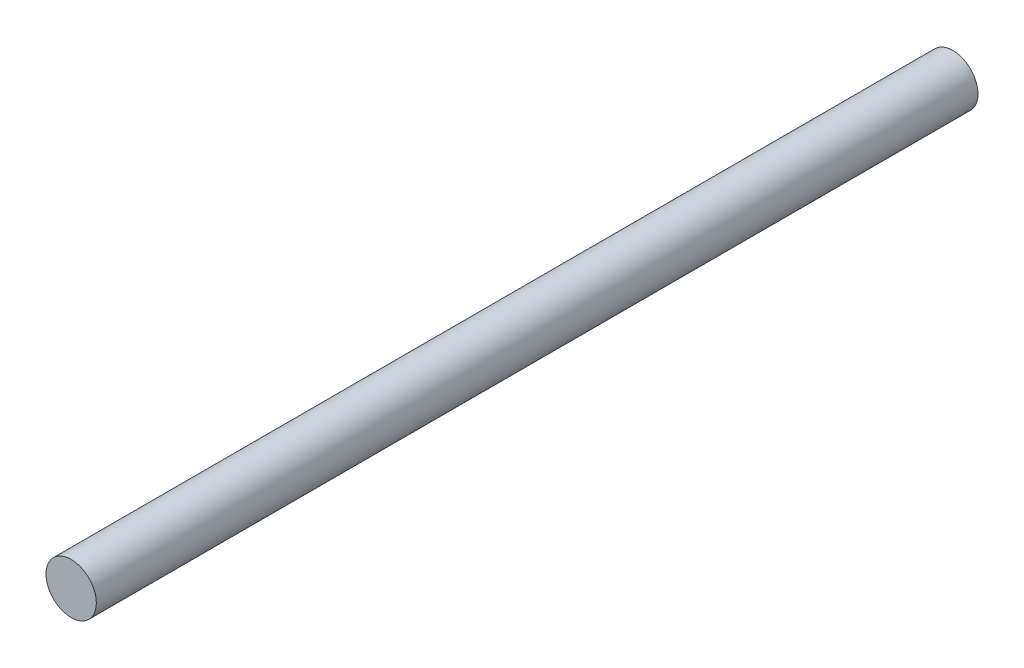
ISO-10303-21;
HEADER;
FILE_DESCRIPTION(('STEP AP214'),'2;1');
FILE_NAME('part.step','',(''),(''),'','','');
FILE_SCHEMA(('AUTOMOTIVE_DESIGN { 1 0 10303 214 1 1 1 1 }'));
ENDSEC;
DATA;
#1=APPLICATION_CONTEXT('core data for automotive mechanical design processes');
#2=APPLICATION_PROTOCOL_DEFINITION('international standard','automotive_design',2000,#1);
#3=PRODUCT_CONTEXT('',#1,'mechanical');
#4=PRODUCT('Part','Part','',(#3));
#5=PRODUCT_RELATED_PRODUCT_CATEGORY('part','',(#4));
#6=PRODUCT_DEFINITION_FORMATION('','',#4);
#7=PRODUCT_DEFINITION_CONTEXT('part definition',#1,'design');
#8=PRODUCT_DEFINITION('design','',#6,#7);
#9=PRODUCT_DEFINITION_SHAPE('','',#8);
#10=(LENGTH_UNIT() NAMED_UNIT(*) SI_UNIT(.MILLI.,.METRE.));
#11=(NAMED_UNIT(*) PLANE_ANGLE_UNIT() SI_UNIT($,.RADIAN.));
#12=(NAMED_UNIT(*) SI_UNIT($,.STERADIAN.) SOLID_ANGLE_UNIT());
#13=UNCERTAINTY_MEASURE_WITH_UNIT(LENGTH_MEASURE(1.E-05),#10,'distance_accuracy_value','');
#14=(GEOMETRIC_REPRESENTATION_CONTEXT(3) GLOBAL_UNCERTAINTY_ASSIGNED_CONTEXT((#13)) GLOBAL_UNIT_ASSIGNED_CONTEXT((#10,
#11,#12)) REPRESENTATION_CONTEXT('',''));
#15=CARTESIAN_POINT('',(0.,0.,0.));
#16=DIRECTION('',(0.,0.,1.));
#17=DIRECTION('',(1.,0.,0.));
#18=AXIS2_PLACEMENT_3D('',#15,#16,#17);
#19=CARTESIAN_POINT('',(0.,0.,70.));
#20=DIRECTION('',(0.,0.,-1.));
#21=DIRECTION('',(-1.,0.,0.));
#22=AXIS2_PLACEMENT_3D('',#19,#20,#21);
#23=CYLINDRICAL_SURFACE('',#22,2.);
#24=CARTESIAN_POINT('',(0.,0.,70.));
#25=DIRECTION('',(0.,0.,1.));
#26=DIRECTION('',(1.,0.,0.));
#27=AXIS2_PLACEMENT_3D('',#24,#25,#26);
#28=CIRCLE('',#27,2.);
#29=CARTESIAN_POINT('',(2.,0.,70.));
#30=VERTEX_POINT('',#29);
#31=EDGE_CURVE('E12',#30,#30,#28,.T.);
#32=ORIENTED_EDGE('',*,*,#31,.F.);
#33=EDGE_LOOP('',(#32));
#34=FACE_BOUND('',#33,.T.);
#35=CARTESIAN_POINT('',(0.,0.,0.));
#36=DIRECTION('',(0.,0.,1.));
#37=DIRECTION('',(1.,0.,0.));
#38=AXIS2_PLACEMENT_3D('',#35,#36,#37);
#39=CIRCLE('',#38,2.);
#40=CARTESIAN_POINT('',(2.,0.,0.));
#41=VERTEX_POINT('',#40);
#42=EDGE_CURVE('E45',#41,#41,#39,.T.);
#43=ORIENTED_EDGE('',*,*,#42,.T.);
#44=EDGE_LOOP('',(#43));
#45=FACE_BOUND('',#44,.T.);
#46=ADVANCED_FACE('F42',(#34,#45),#23,.T.);
#47=CARTESIAN_POINT('',(0.,0.,70.));
#48=DIRECTION('',(0.,0.,1.));
#49=DIRECTION('',(1.,0.,0.));
#50=AXIS2_PLACEMENT_3D('',#47,#48,#49);
#51=PLANE('',#50);
#52=ORIENTED_EDGE('',*,*,#31,.T.);
#53=EDGE_LOOP('',(#52));
#54=FACE_BOUND('',#53,.T.);
#55=ADVANCED_FACE('F71',(#54),#51,.T.);
#56=CARTESIAN_POINT('',(0.,0.,0.));
#57=DIRECTION('',(0.,0.,1.));
#58=DIRECTION('',(1.,0.,0.));
#59=AXIS2_PLACEMENT_3D('',#56,#57,#58);
#60=PLANE('',#59);
#61=CARTESIAN_POINT('',(0.,0.,0.));
#62=DIRECTION('',(0.,0.,-1.));
#63=DIRECTION('',(-1.,0.,0.));
#64=AXIS2_PLACEMENT_3D('',#61,#62,#63);
#65=CIRCLE('',#64,1.);
#66=CARTESIAN_POINT('',(-1.,0.,0.));
#67=VERTEX_POINT('',#66);
#68=EDGE_CURVE('E54',#67,#67,#65,.T.);
#69=ORIENTED_EDGE('',*,*,#68,.F.);
#70=EDGE_LOOP('',(#69));
#71=FACE_BOUND('',#70,.T.);
#72=ORIENTED_EDGE('',*,*,#42,.F.);
#73=EDGE_LOOP('',(#72));
#74=FACE_BOUND('',#73,.T.);
#75=ADVANCED_FACE('F65',(#71,#74),#60,.F.);
#76=CARTESIAN_POINT('',(0.,0.,8.));
#77=DIRECTION('',(0.,0.,-1.));
#78=DIRECTION('',(-1.,0.,0.));
#79=AXIS2_PLACEMENT_3D('',#76,#77,#78);
#80=CYLINDRICAL_SURFACE('',#79,1.);
#81=CARTESIAN_POINT('',(0.,0.,8.));
#82=DIRECTION('',(0.,0.,-1.));
#83=DIRECTION('',(-1.,0.,0.));
#84=AXIS2_PLACEMENT_3D('',#81,#82,#83);
#85=CIRCLE('',#84,1.);
#86=CARTESIAN_POINT('',(-1.,0.,8.));
#87=VERTEX_POINT('',#86);
#88=EDGE_CURVE('E52',#87,#87,#85,.T.);
#89=ORIENTED_EDGE('',*,*,#88,.F.);
#90=EDGE_LOOP('',(#89));
#91=FACE_BOUND('',#90,.T.);
#92=ORIENTED_EDGE('',*,*,#68,.T.);
#93=EDGE_LOOP('',(#92));
#94=FACE_BOUND('',#93,.T.);
#95=ADVANCED_FACE('F62',(#91,#94),#80,.F.);
#96=CARTESIAN_POINT('',(0.,0.,8.));
#97=DIRECTION('',(0.,0.,-1.));
#98=DIRECTION('',(-1.,0.,0.));
#99=AXIS2_PLACEMENT_3D('',#96,#97,#98);
#100=PLANE('',#99);
#101=ORIENTED_EDGE('',*,*,#88,.T.);
#102=EDGE_LOOP('',(#101));
#103=FACE_BOUND('',#102,.T.);
#104=ADVANCED_FACE('F60',(#103),#100,.T.);
#105=CLOSED_SHELL('',(#46,#55,#75,#95,#104));
#106=MANIFOLD_SOLID_BREP('B2',#105);
#107=ADVANCED_BREP_SHAPE_REPRESENTATION('',(#18,#106),#14);
#108=SHAPE_DEFINITION_REPRESENTATION(#9,#107);
ENDSEC;
END-ISO-10303-21;
